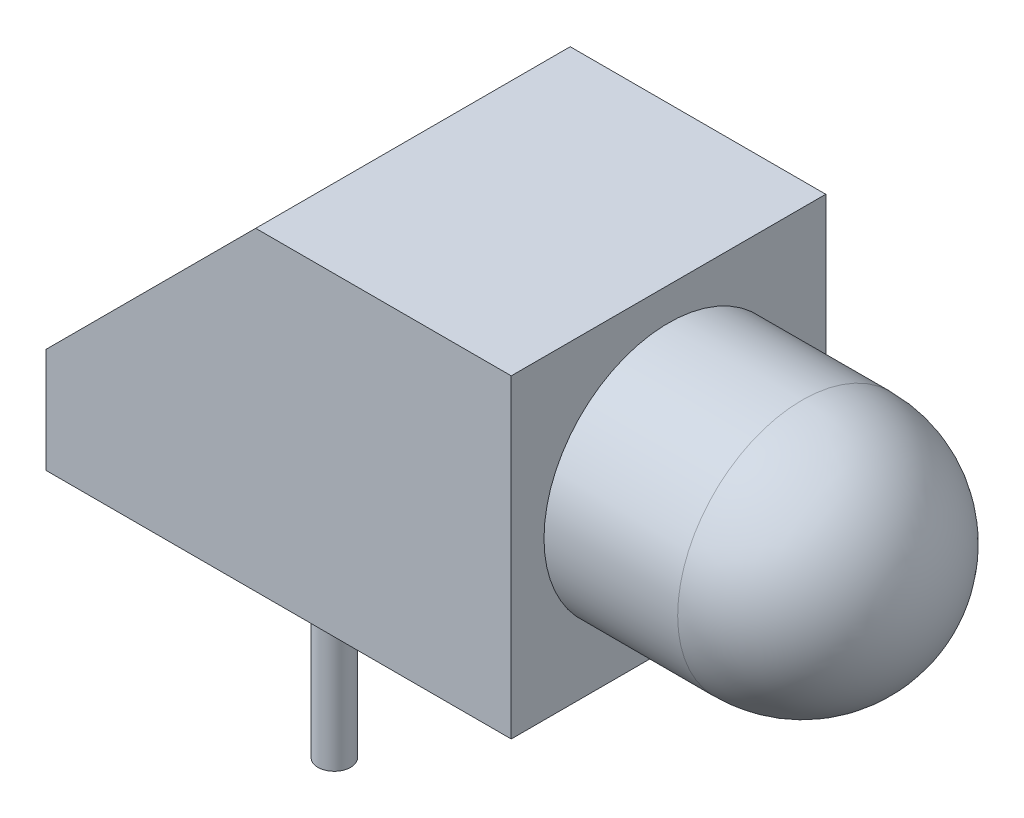
ISO-10303-21;
HEADER;
FILE_DESCRIPTION(('STEP AP214'),'2;1');
FILE_NAME('part.step','',(''),(''),'','','');
FILE_SCHEMA(('AUTOMOTIVE_DESIGN { 1 0 10303 214 1 1 1 1 }'));
ENDSEC;
DATA;
#1=APPLICATION_CONTEXT('core data for automotive mechanical design processes');
#2=APPLICATION_PROTOCOL_DEFINITION('international standard','automotive_design',2000,#1);
#3=PRODUCT_CONTEXT('',#1,'mechanical');
#4=PRODUCT('Part','Part','',(#3));
#5=PRODUCT_RELATED_PRODUCT_CATEGORY('part','',(#4));
#6=PRODUCT_DEFINITION_FORMATION('','',#4);
#7=PRODUCT_DEFINITION_CONTEXT('part definition',#1,'design');
#8=PRODUCT_DEFINITION('design','',#6,#7);
#9=PRODUCT_DEFINITION_SHAPE('','',#8);
#10=(LENGTH_UNIT() NAMED_UNIT(*) SI_UNIT(.MILLI.,.METRE.));
#11=(NAMED_UNIT(*) PLANE_ANGLE_UNIT() SI_UNIT($,.RADIAN.));
#12=(NAMED_UNIT(*) SI_UNIT($,.STERADIAN.) SOLID_ANGLE_UNIT());
#13=UNCERTAINTY_MEASURE_WITH_UNIT(LENGTH_MEASURE(1.E-05),#10,'distance_accuracy_value','');
#14=(GEOMETRIC_REPRESENTATION_CONTEXT(3) GLOBAL_UNCERTAINTY_ASSIGNED_CONTEXT((#13)) GLOBAL_UNIT_ASSIGNED_CONTEXT((#10,
#11,#12)) REPRESENTATION_CONTEXT('',''));
#15=CARTESIAN_POINT('',(0.,0.,0.));
#16=DIRECTION('',(0.,0.,1.));
#17=DIRECTION('',(1.,0.,0.));
#18=AXIS2_PLACEMENT_3D('',#15,#16,#17);
#19=CARTESIAN_POINT('',(0.,0.,3.048));
#20=DIRECTION('',(-1.,0.,0.));
#21=DIRECTION('',(0.,-1.,0.));
#22=AXIS2_PLACEMENT_3D('',#19,#20,#21);
#23=PLANE('',#22);
#24=DIRECTION('',(0.,1.,0.));
#25=VECTOR('',#24,1.);
#26=CARTESIAN_POINT('',(0.,0.,-3.048));
#27=LINE('',#26,#25);
#28=CARTESIAN_POINT('',(0.,0.,-3.048));
#29=VERTEX_POINT('',#28);
#30=CARTESIAN_POINT('',(0.,6.096,-3.048));
#31=VERTEX_POINT('',#30);
#32=EDGE_CURVE('E79',#29,#31,#27,.T.);
#33=ORIENTED_EDGE('',*,*,#32,.T.);
#34=DIRECTION('',(0.,0.,-1.));
#35=VECTOR('',#34,1.);
#36=CARTESIAN_POINT('',(0.,6.096,3.048));
#37=LINE('',#36,#35);
#38=CARTESIAN_POINT('',(0.,6.096,3.048));
#39=VERTEX_POINT('',#38);
#40=EDGE_CURVE('E96',#39,#31,#37,.T.);
#41=ORIENTED_EDGE('',*,*,#40,.F.);
#42=DIRECTION('',(0.,1.,0.));
#43=VECTOR('',#42,1.);
#44=CARTESIAN_POINT('',(0.,0.,3.048));
#45=LINE('',#44,#43);
#46=CARTESIAN_POINT('',(0.,0.,3.048));
#47=VERTEX_POINT('',#46);
#48=EDGE_CURVE('E93',#47,#39,#45,.T.);
#49=ORIENTED_EDGE('',*,*,#48,.F.);
#50=DIRECTION('',(0.,0.,-1.));
#51=VECTOR('',#50,1.);
#52=CARTESIAN_POINT('',(0.,0.,3.048));
#53=LINE('',#52,#51);
#54=EDGE_CURVE('E40',#47,#29,#53,.T.);
#55=ORIENTED_EDGE('',*,*,#54,.T.);
#56=EDGE_LOOP('',(#33,#41,#49,#55));
#57=FACE_BOUND('',#56,.T.);
#58=CARTESIAN_POINT('',(0.,3.048,0.));
#59=DIRECTION('',(-1.,0.,0.));
#60=DIRECTION('',(0.,-1.,0.));
#61=AXIS2_PLACEMENT_3D('',#58,#59,#60);
#62=CIRCLE('',#61,2.413);
#63=CARTESIAN_POINT('',(0.,0.635000000000001,0.));
#64=VERTEX_POINT('',#63);
#65=EDGE_CURVE('E11',#64,#64,#62,.F.);
#66=ORIENTED_EDGE('',*,*,#65,.F.);
#67=EDGE_LOOP('',(#66));
#68=FACE_BOUND('',#67,.T.);
#69=ADVANCED_FACE('F32',(#57,#68),#23,.F.);
#70=CARTESIAN_POINT('',(-9.017,0.,3.048));
#71=DIRECTION('',(0.,1.,0.));
#72=DIRECTION('',(0.,0.,1.));
#73=AXIS2_PLACEMENT_3D('',#70,#71,#72);
#74=PLANE('',#73);
#75=CARTESIAN_POINT('',(-5.207,0.,-1.27));
#76=DIRECTION('',(0.,1.,0.));
#77=DIRECTION('',(0.,0.,1.));
#78=AXIS2_PLACEMENT_3D('',#75,#76,#77);
#79=CIRCLE('',#78,0.3175);
#80=CARTESIAN_POINT('',(-5.207,0.,-0.9525));
#81=VERTEX_POINT('',#80);
#82=EDGE_CURVE('E247',#81,#81,#79,.T.);
#83=ORIENTED_EDGE('',*,*,#82,.T.);
#84=EDGE_LOOP('',(#83));
#85=FACE_BOUND('',#84,.T.);
#86=CARTESIAN_POINT('',(-5.207,0.,1.27));
#87=DIRECTION('',(0.,1.,0.));
#88=DIRECTION('',(0.,0.,1.));
#89=AXIS2_PLACEMENT_3D('',#86,#87,#88);
#90=CIRCLE('',#89,0.3175);
#91=CARTESIAN_POINT('',(-5.207,0.,1.5875));
#92=VERTEX_POINT('',#91);
#93=EDGE_CURVE('E246',#92,#92,#90,.T.);
#94=ORIENTED_EDGE('',*,*,#93,.T.);
#95=EDGE_LOOP('',(#94));
#96=FACE_BOUND('',#95,.T.);
#97=DIRECTION('',(1.,0.,0.));
#98=VECTOR('',#97,1.);
#99=CARTESIAN_POINT('',(-9.017,0.,-3.048));
#100=LINE('',#99,#98);
#101=CARTESIAN_POINT('',(-9.017,0.,-3.048));
#102=VERTEX_POINT('',#101);
#103=EDGE_CURVE('E84',#102,#29,#100,.T.);
#104=ORIENTED_EDGE('',*,*,#103,.T.);
#105=ORIENTED_EDGE('',*,*,#54,.F.);
#106=DIRECTION('',(1.,0.,0.));
#107=VECTOR('',#106,1.);
#108=CARTESIAN_POINT('',(-9.017,0.,3.048));
#109=LINE('',#108,#107);
#110=CARTESIAN_POINT('',(-9.017,0.,3.048));
#111=VERTEX_POINT('',#110);
#112=EDGE_CURVE('E111',#111,#47,#109,.T.);
#113=ORIENTED_EDGE('',*,*,#112,.F.);
#114=DIRECTION('',(0.,0.,-1.));
#115=VECTOR('',#114,1.);
#116=CARTESIAN_POINT('',(-9.017,0.,3.048));
#117=LINE('',#116,#115);
#118=EDGE_CURVE('E98',#111,#102,#117,.T.);
#119=ORIENTED_EDGE('',*,*,#118,.T.);
#120=EDGE_LOOP('',(#104,#105,#113,#119));
#121=FACE_BOUND('',#120,.T.);
#122=ADVANCED_FACE('F34',(#85,#96,#121),#74,.F.);
#123=CARTESIAN_POINT('',(0.,6.096,3.048));
#124=DIRECTION('',(0.,-1.,0.));
#125=DIRECTION('',(1.,0.,0.));
#126=AXIS2_PLACEMENT_3D('',#123,#124,#125);
#127=PLANE('',#126);
#128=DIRECTION('',(-1.,0.,0.));
#129=VECTOR('',#128,1.);
#130=CARTESIAN_POINT('',(0.,6.096,-3.048));
#131=LINE('',#130,#129);
#132=CARTESIAN_POINT('',(-4.953,6.096,-3.048));
#133=VERTEX_POINT('',#132);
#134=EDGE_CURVE('E86',#31,#133,#131,.T.);
#135=ORIENTED_EDGE('',*,*,#134,.T.);
#136=DIRECTION('',(0.,0.,-1.));
#137=VECTOR('',#136,1.);
#138=CARTESIAN_POINT('',(-4.953,6.096,3.048));
#139=LINE('',#138,#137);
#140=CARTESIAN_POINT('',(-4.953,6.096,3.048));
#141=VERTEX_POINT('',#140);
#142=EDGE_CURVE('E122',#141,#133,#139,.T.);
#143=ORIENTED_EDGE('',*,*,#142,.F.);
#144=DIRECTION('',(-1.,0.,0.));
#145=VECTOR('',#144,1.);
#146=CARTESIAN_POINT('',(0.,6.096,3.048));
#147=LINE('',#146,#145);
#148=EDGE_CURVE('E114',#39,#141,#147,.T.);
#149=ORIENTED_EDGE('',*,*,#148,.F.);
#150=ORIENTED_EDGE('',*,*,#40,.T.);
#151=EDGE_LOOP('',(#135,#143,#149,#150));
#152=FACE_BOUND('',#151,.T.);
#153=ADVANCED_FACE('F127',(#152),#127,.F.);
#154=CARTESIAN_POINT('',(-4.953,6.096,3.048));
#155=DIRECTION('',(0.707106781186549,-0.707106781186546,0.));
#156=DIRECTION('',(0.707106781186546,0.707106781186549,0.));
#157=AXIS2_PLACEMENT_3D('',#154,#155,#156);
#158=PLANE('',#157);
#159=DIRECTION('',(-0.707106781186546,-0.707106781186549,0.));
#160=VECTOR('',#159,1.);
#161=CARTESIAN_POINT('',(-4.953,6.096,-3.048));
#162=LINE('',#161,#160);
#163=CARTESIAN_POINT('',(-9.017,2.03199999999998,-3.048));
#164=VERTEX_POINT('',#163);
#165=EDGE_CURVE('E107',#133,#164,#162,.T.);
#166=ORIENTED_EDGE('',*,*,#165,.T.);
#167=DIRECTION('',(0.,0.,-1.));
#168=VECTOR('',#167,1.);
#169=CARTESIAN_POINT('',(-9.017,2.03199999999998,3.048));
#170=LINE('',#169,#168);
#171=CARTESIAN_POINT('',(-9.017,2.03199999999998,3.048));
#172=VERTEX_POINT('',#171);
#173=EDGE_CURVE('E119',#172,#164,#170,.T.);
#174=ORIENTED_EDGE('',*,*,#173,.F.);
#175=DIRECTION('',(-0.707106781186546,-0.707106781186549,0.));
#176=VECTOR('',#175,1.);
#177=CARTESIAN_POINT('',(-4.953,6.096,3.048));
#178=LINE('',#177,#176);
#179=EDGE_CURVE('E52',#141,#172,#178,.T.);
#180=ORIENTED_EDGE('',*,*,#179,.F.);
#181=ORIENTED_EDGE('',*,*,#142,.T.);
#182=EDGE_LOOP('',(#166,#174,#180,#181));
#183=FACE_BOUND('',#182,.T.);
#184=ADVANCED_FACE('F139',(#183),#158,.F.);
#185=CARTESIAN_POINT('',(-9.017,2.03199999999998,3.048));
#186=DIRECTION('',(1.,0.,0.));
#187=DIRECTION('',(0.,0.,-1.));
#188=AXIS2_PLACEMENT_3D('',#185,#186,#187);
#189=PLANE('',#188);
#190=DIRECTION('',(0.,-1.,0.));
#191=VECTOR('',#190,1.);
#192=CARTESIAN_POINT('',(-9.017,2.03199999999998,-3.048));
#193=LINE('',#192,#191);
#194=EDGE_CURVE('E109',#164,#102,#193,.T.);
#195=ORIENTED_EDGE('',*,*,#194,.T.);
#196=ORIENTED_EDGE('',*,*,#118,.F.);
#197=DIRECTION('',(0.,-1.,0.));
#198=VECTOR('',#197,1.);
#199=CARTESIAN_POINT('',(-9.017,2.03199999999998,3.048));
#200=LINE('',#199,#198);
#201=EDGE_CURVE('E47',#172,#111,#200,.T.);
#202=ORIENTED_EDGE('',*,*,#201,.F.);
#203=ORIENTED_EDGE('',*,*,#173,.T.);
#204=EDGE_LOOP('',(#195,#196,#202,#203));
#205=FACE_BOUND('',#204,.T.);
#206=ADVANCED_FACE('F131',(#205),#189,.F.);
#207=CARTESIAN_POINT('',(-9.017,0.,3.048));
#208=DIRECTION('',(0.,0.,-1.));
#209=DIRECTION('',(-1.,0.,0.));
#210=AXIS2_PLACEMENT_3D('',#207,#208,#209);
#211=PLANE('',#210);
#212=ORIENTED_EDGE('',*,*,#112,.T.);
#213=ORIENTED_EDGE('',*,*,#48,.T.);
#214=ORIENTED_EDGE('',*,*,#148,.T.);
#215=ORIENTED_EDGE('',*,*,#179,.T.);
#216=ORIENTED_EDGE('',*,*,#201,.T.);
#217=EDGE_LOOP('',(#212,#213,#214,#215,#216));
#218=FACE_BOUND('',#217,.T.);
#219=ADVANCED_FACE('F129',(#218),#211,.F.);
#220=CARTESIAN_POINT('',(-9.017,0.,-3.048));
#221=DIRECTION('',(0.,0.,-1.));
#222=DIRECTION('',(-1.,0.,0.));
#223=AXIS2_PLACEMENT_3D('',#220,#221,#222);
#224=PLANE('',#223);
#225=ORIENTED_EDGE('',*,*,#103,.F.);
#226=ORIENTED_EDGE('',*,*,#194,.F.);
#227=ORIENTED_EDGE('',*,*,#165,.F.);
#228=ORIENTED_EDGE('',*,*,#134,.F.);
#229=ORIENTED_EDGE('',*,*,#32,.F.);
#230=EDGE_LOOP('',(#225,#226,#227,#228,#229));
#231=FACE_BOUND('',#230,.T.);
#232=ADVANCED_FACE('F81',(#231),#224,.T.);
#233=CARTESIAN_POINT('',(5.0038,3.048,0.));
#234=DIRECTION('',(-1.,0.,0.));
#235=DIRECTION('',(0.,0.,1.));
#236=AXIS2_PLACEMENT_3D('',#233,#234,#235);
#237=CYLINDRICAL_SURFACE('',#236,2.413);
#238=CARTESIAN_POINT('',(2.5908,3.048,0.));
#239=DIRECTION('',(-1.,0.,0.));
#240=DIRECTION('',(0.,0.,1.));
#241=AXIS2_PLACEMENT_3D('',#238,#239,#240);
#242=CIRCLE('',#241,2.413);
#243=CARTESIAN_POINT('',(2.5908,3.048,2.413));
#244=VERTEX_POINT('',#243);
#245=EDGE_CURVE('E99',#244,#244,#242,.T.);
#246=ORIENTED_EDGE('',*,*,#245,.T.);
#247=EDGE_LOOP('',(#246));
#248=FACE_BOUND('',#247,.T.);
#249=ORIENTED_EDGE('',*,*,#65,.T.);
#250=EDGE_LOOP('',(#249));
#251=FACE_BOUND('',#250,.T.);
#252=ADVANCED_FACE('F137',(#248,#251),#237,.T.);
#253=CARTESIAN_POINT('',(2.5908,3.048,0.));
#254=DIRECTION('',(-1.,0.,0.));
#255=DIRECTION('',(0.,1.,0.));
#256=AXIS2_PLACEMENT_3D('',#253,#254,#255);
#257=SPHERICAL_SURFACE('',#256,2.413);
#258=ORIENTED_EDGE('',*,*,#245,.F.);
#259=EDGE_LOOP('',(#258));
#260=FACE_BOUND('',#259,.T.);
#261=ADVANCED_FACE('F189',(#260),#257,.T.);
#262=CARTESIAN_POINT('',(-5.207,-3.81,1.27));
#263=DIRECTION('',(0.,1.,0.));
#264=DIRECTION('',(0.,0.,1.));
#265=AXIS2_PLACEMENT_3D('',#262,#263,#264);
#266=CYLINDRICAL_SURFACE('',#265,0.3175);
#267=CARTESIAN_POINT('',(-5.207,-3.81,1.27));
#268=DIRECTION('',(0.,1.,0.));
#269=DIRECTION('',(0.,0.,1.));
#270=AXIS2_PLACEMENT_3D('',#267,#268,#269);
#271=CIRCLE('',#270,0.3175);
#272=CARTESIAN_POINT('',(-5.207,-3.81,1.5875));
#273=VERTEX_POINT('',#272);
#274=EDGE_CURVE('E102',#273,#273,#271,.T.);
#275=ORIENTED_EDGE('',*,*,#274,.T.);
#276=EDGE_LOOP('',(#275));
#277=FACE_BOUND('',#276,.T.);
#278=ORIENTED_EDGE('',*,*,#93,.F.);
#279=EDGE_LOOP('',(#278));
#280=FACE_BOUND('',#279,.T.);
#281=ADVANCED_FACE('F198',(#277,#280),#266,.T.);
#282=CARTESIAN_POINT('',(-5.207,-3.81,1.27));
#283=DIRECTION('',(0.,1.,0.));
#284=DIRECTION('',(0.,0.,1.));
#285=AXIS2_PLACEMENT_3D('',#282,#283,#284);
#286=PLANE('',#285);
#287=ORIENTED_EDGE('',*,*,#274,.F.);
#288=EDGE_LOOP('',(#287));
#289=FACE_BOUND('',#288,.T.);
#290=ADVANCED_FACE('F207',(#289),#286,.F.);
#291=CARTESIAN_POINT('',(-5.207,-3.81,-1.27));
#292=DIRECTION('',(0.,1.,0.));
#293=DIRECTION('',(0.,0.,1.));
#294=AXIS2_PLACEMENT_3D('',#291,#292,#293);
#295=CYLINDRICAL_SURFACE('',#294,0.3175);
#296=CARTESIAN_POINT('',(-5.207,-3.81,-1.27));
#297=DIRECTION('',(0.,1.,0.));
#298=DIRECTION('',(0.,0.,1.));
#299=AXIS2_PLACEMENT_3D('',#296,#297,#298);
#300=CIRCLE('',#299,0.3175);
#301=CARTESIAN_POINT('',(-5.207,-3.81,-0.9525));
#302=VERTEX_POINT('',#301);
#303=EDGE_CURVE('E245',#302,#302,#300,.T.);
#304=ORIENTED_EDGE('',*,*,#303,.T.);
#305=EDGE_LOOP('',(#304));
#306=FACE_BOUND('',#305,.T.);
#307=ORIENTED_EDGE('',*,*,#82,.F.);
#308=EDGE_LOOP('',(#307));
#309=FACE_BOUND('',#308,.T.);
#310=ADVANCED_FACE('F216',(#306,#309),#295,.T.);
#311=CARTESIAN_POINT('',(-5.207,-3.81,-1.27));
#312=DIRECTION('',(0.,1.,0.));
#313=DIRECTION('',(0.,0.,1.));
#314=AXIS2_PLACEMENT_3D('',#311,#312,#313);
#315=PLANE('',#314);
#316=ORIENTED_EDGE('',*,*,#303,.F.);
#317=EDGE_LOOP('',(#316));
#318=FACE_BOUND('',#317,.T.);
#319=ADVANCED_FACE('F225',(#318),#315,.F.);
#320=CLOSED_SHELL('',(#69,#122,#153,#184,#206,#219,#232,#252,#261,#281,#290,#310,#319));
#321=MANIFOLD_SOLID_BREP('B2',#320);
#322=ADVANCED_BREP_SHAPE_REPRESENTATION('',(#18,#321),#14);
#323=SHAPE_DEFINITION_REPRESENTATION(#9,#322);
ENDSEC;
END-ISO-10303-21;
